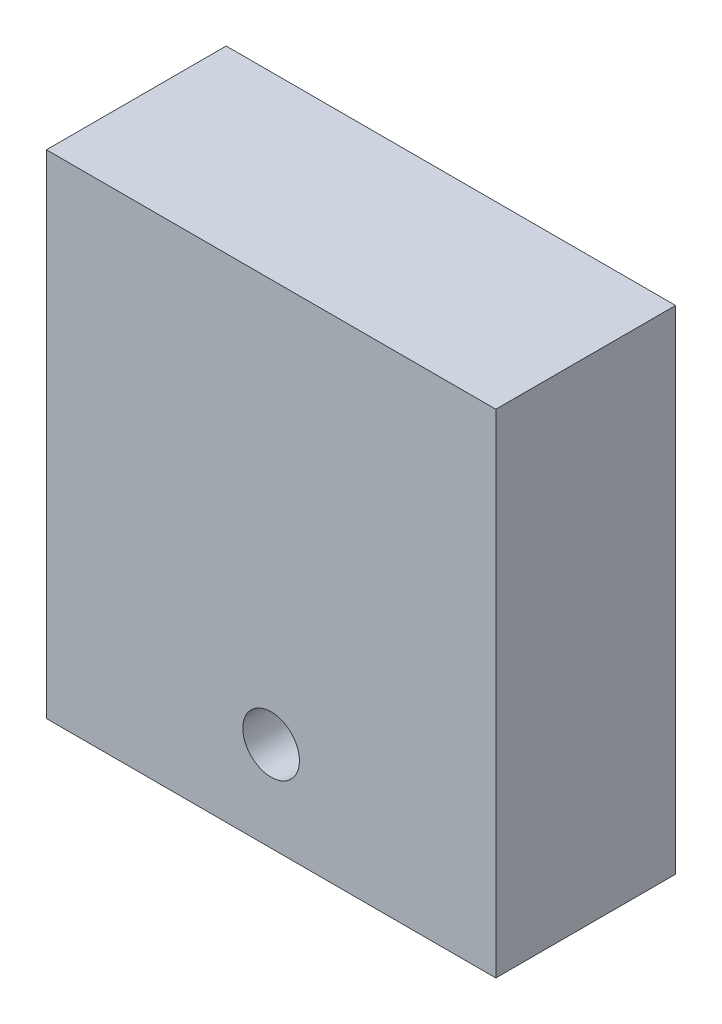
ISO-10303-21;
HEADER;
FILE_DESCRIPTION(('STEP AP214'),'2;1');
FILE_NAME('part.step','',(''),(''),'','','');
FILE_SCHEMA(('AUTOMOTIVE_DESIGN { 1 0 10303 214 1 1 1 1 }'));
ENDSEC;
DATA;
#1=APPLICATION_CONTEXT('core data for automotive mechanical design processes');
#2=APPLICATION_PROTOCOL_DEFINITION('international standard','automotive_design',2000,#1);
#3=PRODUCT_CONTEXT('',#1,'mechanical');
#4=PRODUCT('Part','Part','',(#3));
#5=PRODUCT_RELATED_PRODUCT_CATEGORY('part','',(#4));
#6=PRODUCT_DEFINITION_FORMATION('','',#4);
#7=PRODUCT_DEFINITION_CONTEXT('part definition',#1,'design');
#8=PRODUCT_DEFINITION('design','',#6,#7);
#9=PRODUCT_DEFINITION_SHAPE('','',#8);
#10=(LENGTH_UNIT() NAMED_UNIT(*) SI_UNIT(.MILLI.,.METRE.));
#11=(NAMED_UNIT(*) PLANE_ANGLE_UNIT() SI_UNIT($,.RADIAN.));
#12=(NAMED_UNIT(*) SI_UNIT($,.STERADIAN.) SOLID_ANGLE_UNIT());
#13=UNCERTAINTY_MEASURE_WITH_UNIT(LENGTH_MEASURE(1.E-05),#10,'distance_accuracy_value','');
#14=(GEOMETRIC_REPRESENTATION_CONTEXT(3) GLOBAL_UNCERTAINTY_ASSIGNED_CONTEXT((#13)) GLOBAL_UNIT_ASSIGNED_CONTEXT((#10,
#11,#12)) REPRESENTATION_CONTEXT('',''));
#15=CARTESIAN_POINT('',(0.,0.,0.));
#16=DIRECTION('',(0.,0.,1.));
#17=DIRECTION('',(1.,0.,0.));
#18=AXIS2_PLACEMENT_3D('',#15,#16,#17);
#19=CARTESIAN_POINT('',(0.,0.,6.35));
#20=DIRECTION('',(1.,0.,0.));
#21=DIRECTION('',(0.,0.,-1.));
#22=AXIS2_PLACEMENT_3D('',#19,#20,#21);
#23=PLANE('',#22);
#24=DIRECTION('',(0.,-1.,0.));
#25=VECTOR('',#24,1.);
#26=CARTESIAN_POINT('',(0.,0.,0.));
#27=LINE('',#26,#25);
#28=CARTESIAN_POINT('',(0.,17.4,0.));
#29=VERTEX_POINT('',#28);
#30=CARTESIAN_POINT('',(0.,0.,0.));
#31=VERTEX_POINT('',#30);
#32=EDGE_CURVE('E95',#29,#31,#27,.T.);
#33=ORIENTED_EDGE('',*,*,#32,.T.);
#34=DIRECTION('',(0.,0.,-1.));
#35=VECTOR('',#34,1.);
#36=CARTESIAN_POINT('',(0.,0.,6.35));
#37=LINE('',#36,#35);
#38=CARTESIAN_POINT('',(0.,0.,6.35));
#39=VERTEX_POINT('',#38);
#40=EDGE_CURVE('E11',#39,#31,#37,.T.);
#41=ORIENTED_EDGE('',*,*,#40,.F.);
#42=DIRECTION('',(0.,-1.,0.));
#43=VECTOR('',#42,1.);
#44=CARTESIAN_POINT('',(0.,0.,6.35));
#45=LINE('',#44,#43);
#46=CARTESIAN_POINT('',(0.,17.4,6.35));
#47=VERTEX_POINT('',#46);
#48=EDGE_CURVE('E83',#47,#39,#45,.T.);
#49=ORIENTED_EDGE('',*,*,#48,.F.);
#50=DIRECTION('',(0.,0.,-1.));
#51=VECTOR('',#50,1.);
#52=CARTESIAN_POINT('',(0.,17.4,6.35));
#53=LINE('',#52,#51);
#54=EDGE_CURVE('E91',#47,#29,#53,.T.);
#55=ORIENTED_EDGE('',*,*,#54,.T.);
#56=EDGE_LOOP('',(#33,#41,#49,#55));
#57=FACE_BOUND('',#56,.T.);
#58=ADVANCED_FACE('F32',(#57),#23,.F.);
#59=CARTESIAN_POINT('',(0.,0.,6.35));
#60=DIRECTION('',(0.,1.,0.));
#61=DIRECTION('',(0.,0.,1.));
#62=AXIS2_PLACEMENT_3D('',#59,#60,#61);
#63=PLANE('',#62);
#64=DIRECTION('',(1.,0.,0.));
#65=VECTOR('',#64,1.);
#66=CARTESIAN_POINT('',(0.,0.,0.));
#67=LINE('',#66,#65);
#68=CARTESIAN_POINT('',(15.875,0.,0.));
#69=VERTEX_POINT('',#68);
#70=EDGE_CURVE('E87',#31,#69,#67,.T.);
#71=ORIENTED_EDGE('',*,*,#70,.T.);
#72=DIRECTION('',(0.,0.,-1.));
#73=VECTOR('',#72,1.);
#74=CARTESIAN_POINT('',(15.875,0.,6.35));
#75=LINE('',#74,#73);
#76=CARTESIAN_POINT('',(15.875,0.,6.35));
#77=VERTEX_POINT('',#76);
#78=EDGE_CURVE('E40',#77,#69,#75,.T.);
#79=ORIENTED_EDGE('',*,*,#78,.F.);
#80=DIRECTION('',(1.,0.,0.));
#81=VECTOR('',#80,1.);
#82=CARTESIAN_POINT('',(0.,0.,6.35));
#83=LINE('',#82,#81);
#84=EDGE_CURVE('E78',#39,#77,#83,.T.);
#85=ORIENTED_EDGE('',*,*,#84,.F.);
#86=ORIENTED_EDGE('',*,*,#40,.T.);
#87=EDGE_LOOP('',(#71,#79,#85,#86));
#88=FACE_BOUND('',#87,.T.);
#89=ADVANCED_FACE('F86',(#88),#63,.F.);
#90=CARTESIAN_POINT('',(15.875,0.,6.35));
#91=DIRECTION('',(-1.,0.,0.));
#92=DIRECTION('',(0.,0.,1.));
#93=AXIS2_PLACEMENT_3D('',#90,#91,#92);
#94=PLANE('',#93);
#95=DIRECTION('',(0.,1.,0.));
#96=VECTOR('',#95,1.);
#97=CARTESIAN_POINT('',(15.875,0.,0.));
#98=LINE('',#97,#96);
#99=CARTESIAN_POINT('',(15.875,17.4,0.));
#100=VERTEX_POINT('',#99);
#101=EDGE_CURVE('E65',#69,#100,#98,.T.);
#102=ORIENTED_EDGE('',*,*,#101,.T.);
#103=DIRECTION('',(0.,0.,-1.));
#104=VECTOR('',#103,1.);
#105=CARTESIAN_POINT('',(15.875,17.4,6.35));
#106=LINE('',#105,#104);
#107=CARTESIAN_POINT('',(15.875,17.4,6.35));
#108=VERTEX_POINT('',#107);
#109=EDGE_CURVE('E88',#108,#100,#106,.T.);
#110=ORIENTED_EDGE('',*,*,#109,.F.);
#111=DIRECTION('',(0.,1.,0.));
#112=VECTOR('',#111,1.);
#113=CARTESIAN_POINT('',(15.875,0.,6.35));
#114=LINE('',#113,#112);
#115=EDGE_CURVE('E81',#77,#108,#114,.T.);
#116=ORIENTED_EDGE('',*,*,#115,.F.);
#117=ORIENTED_EDGE('',*,*,#78,.T.);
#118=EDGE_LOOP('',(#102,#110,#116,#117));
#119=FACE_BOUND('',#118,.T.);
#120=ADVANCED_FACE('F89',(#119),#94,.F.);
#121=CARTESIAN_POINT('',(0.,17.4,6.35));
#122=DIRECTION('',(0.,-1.,0.));
#123=DIRECTION('',(0.,0.,-1.));
#124=AXIS2_PLACEMENT_3D('',#121,#122,#123);
#125=PLANE('',#124);
#126=DIRECTION('',(-1.,0.,0.));
#127=VECTOR('',#126,1.);
#128=CARTESIAN_POINT('',(0.,17.4,0.));
#129=LINE('',#128,#127);
#130=EDGE_CURVE('E71',#100,#29,#129,.T.);
#131=ORIENTED_EDGE('',*,*,#130,.T.);
#132=ORIENTED_EDGE('',*,*,#54,.F.);
#133=DIRECTION('',(-1.,0.,0.));
#134=VECTOR('',#133,1.);
#135=CARTESIAN_POINT('',(0.,17.4,6.35));
#136=LINE('',#135,#134);
#137=EDGE_CURVE('E48',#108,#47,#136,.T.);
#138=ORIENTED_EDGE('',*,*,#137,.F.);
#139=ORIENTED_EDGE('',*,*,#109,.T.);
#140=EDGE_LOOP('',(#131,#132,#138,#139));
#141=FACE_BOUND('',#140,.T.);
#142=ADVANCED_FACE('F103',(#141),#125,.F.);
#143=CARTESIAN_POINT('',(0.,17.4,6.35));
#144=DIRECTION('',(0.,0.,-1.));
#145=DIRECTION('',(-1.,0.,0.));
#146=AXIS2_PLACEMENT_3D('',#143,#144,#145);
#147=PLANE('',#146);
#148=CARTESIAN_POINT('',(7.9375,3.175,6.35));
#149=DIRECTION('',(0.,0.,1.));
#150=DIRECTION('',(1.,0.,0.));
#151=AXIS2_PLACEMENT_3D('',#148,#149,#150);
#152=CIRCLE('',#151,1.);
#153=CARTESIAN_POINT('',(8.9375,3.175,6.35));
#154=VERTEX_POINT('',#153);
#155=EDGE_CURVE('E109',#154,#154,#152,.T.);
#156=ORIENTED_EDGE('',*,*,#155,.F.);
#157=EDGE_LOOP('',(#156));
#158=FACE_BOUND('',#157,.T.);
#159=ORIENTED_EDGE('',*,*,#48,.T.);
#160=ORIENTED_EDGE('',*,*,#84,.T.);
#161=ORIENTED_EDGE('',*,*,#115,.T.);
#162=ORIENTED_EDGE('',*,*,#137,.T.);
#163=EDGE_LOOP('',(#159,#160,#161,#162));
#164=FACE_BOUND('',#163,.T.);
#165=ADVANCED_FACE('F79',(#158,#164),#147,.F.);
#166=CARTESIAN_POINT('',(0.,17.4,0.));
#167=DIRECTION('',(0.,0.,-1.));
#168=DIRECTION('',(-1.,0.,0.));
#169=AXIS2_PLACEMENT_3D('',#166,#167,#168);
#170=PLANE('',#169);
#171=CARTESIAN_POINT('',(7.9375,3.175,0.));
#172=DIRECTION('',(0.,0.,1.));
#173=DIRECTION('',(1.,0.,0.));
#174=AXIS2_PLACEMENT_3D('',#171,#172,#173);
#175=CIRCLE('',#174,1.);
#176=CARTESIAN_POINT('',(8.9375,3.175,0.));
#177=VERTEX_POINT('',#176);
#178=EDGE_CURVE('E98',#177,#177,#175,.T.);
#179=ORIENTED_EDGE('',*,*,#178,.T.);
#180=EDGE_LOOP('',(#179));
#181=FACE_BOUND('',#180,.T.);
#182=ORIENTED_EDGE('',*,*,#32,.F.);
#183=ORIENTED_EDGE('',*,*,#130,.F.);
#184=ORIENTED_EDGE('',*,*,#101,.F.);
#185=ORIENTED_EDGE('',*,*,#70,.F.);
#186=EDGE_LOOP('',(#182,#183,#184,#185));
#187=FACE_BOUND('',#186,.T.);
#188=ADVANCED_FACE('F106',(#181,#187),#170,.T.);
#189=CARTESIAN_POINT('',(7.9375,3.175,0.));
#190=DIRECTION('',(0.,0.,1.));
#191=DIRECTION('',(1.,0.,0.));
#192=AXIS2_PLACEMENT_3D('',#189,#190,#191);
#193=CYLINDRICAL_SURFACE('',#192,1.);
#194=ORIENTED_EDGE('',*,*,#178,.F.);
#195=EDGE_LOOP('',(#194));
#196=FACE_BOUND('',#195,.T.);
#197=ORIENTED_EDGE('',*,*,#155,.T.);
#198=EDGE_LOOP('',(#197));
#199=FACE_BOUND('',#198,.T.);
#200=ADVANCED_FACE('F116',(#196,#199),#193,.F.);
#201=CLOSED_SHELL('',(#58,#89,#120,#142,#165,#188,#200));
#202=MANIFOLD_SOLID_BREP('B2',#201);
#203=ADVANCED_BREP_SHAPE_REPRESENTATION('',(#18,#202),#14);
#204=SHAPE_DEFINITION_REPRESENTATION(#9,#203);
ENDSEC;
END-ISO-10303-21;
